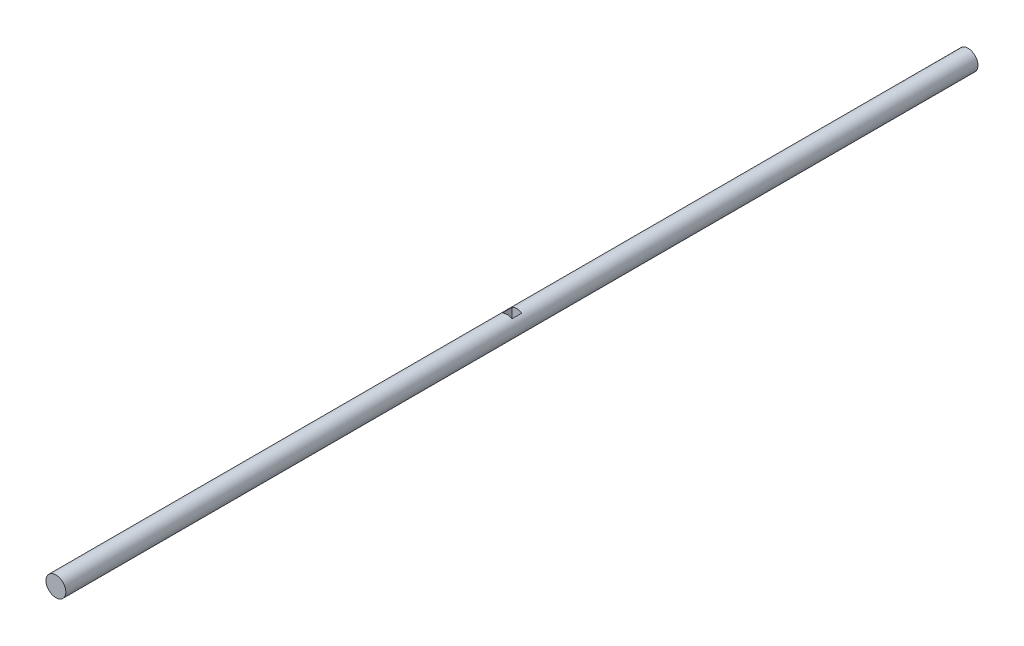
ISO-10303-21;
HEADER;
FILE_DESCRIPTION(('STEP AP214'),'2;1');
FILE_NAME('part.step','',(''),(''),'','','');
FILE_SCHEMA(('AUTOMOTIVE_DESIGN { 1 0 10303 214 1 1 1 1 }'));
ENDSEC;
DATA;
#1=APPLICATION_CONTEXT('core data for automotive mechanical design processes');
#2=APPLICATION_PROTOCOL_DEFINITION('international standard','automotive_design',2000,#1);
#3=PRODUCT_CONTEXT('',#1,'mechanical');
#4=PRODUCT('Part','Part','',(#3));
#5=PRODUCT_RELATED_PRODUCT_CATEGORY('part','',(#4));
#6=PRODUCT_DEFINITION_FORMATION('','',#4);
#7=PRODUCT_DEFINITION_CONTEXT('part definition',#1,'design');
#8=PRODUCT_DEFINITION('design','',#6,#7);
#9=PRODUCT_DEFINITION_SHAPE('','',#8);
#10=(LENGTH_UNIT() NAMED_UNIT(*) SI_UNIT(.MILLI.,.METRE.));
#11=(NAMED_UNIT(*) PLANE_ANGLE_UNIT() SI_UNIT($,.RADIAN.));
#12=(NAMED_UNIT(*) SI_UNIT($,.STERADIAN.) SOLID_ANGLE_UNIT());
#13=UNCERTAINTY_MEASURE_WITH_UNIT(LENGTH_MEASURE(1.E-05),#10,'distance_accuracy_value','');
#14=(GEOMETRIC_REPRESENTATION_CONTEXT(3) GLOBAL_UNCERTAINTY_ASSIGNED_CONTEXT((#13)) GLOBAL_UNIT_ASSIGNED_CONTEXT((#10,
#11,#12)) REPRESENTATION_CONTEXT('',''));
#15=CARTESIAN_POINT('',(0.,0.,0.));
#16=DIRECTION('',(0.,0.,1.));
#17=DIRECTION('',(1.,0.,0.));
#18=AXIS2_PLACEMENT_3D('',#15,#16,#17);
#19=CARTESIAN_POINT('',(0.,0.,230.));
#20=DIRECTION('',(0.,0.,-1.));
#21=DIRECTION('',(-1.,0.,0.));
#22=AXIS2_PLACEMENT_3D('',#19,#20,#21);
#23=CYLINDRICAL_SURFACE('',#22,2.5);
#24=CARTESIAN_POINT('',(0.,0.,116.25));
#25=DIRECTION('',(0.,0.,1.));
#26=DIRECTION('',(1.,0.,0.));
#27=AXIS2_PLACEMENT_3D('',#24,#25,#26);
#28=CIRCLE('',#27,2.5);
#29=CARTESIAN_POINT('',(1.25000000000001,2.16506350946109,116.25));
#30=VERTEX_POINT('',#29);
#31=CARTESIAN_POINT('',(-1.24999999999999,2.1650635094611,116.25));
#32=VERTEX_POINT('',#31);
#33=EDGE_CURVE('E89',#30,#32,#28,.T.);
#34=ORIENTED_EDGE('',*,*,#33,.T.);
#35=DIRECTION('',(0.,0.,-1.));
#36=VECTOR('',#35,1.);
#37=CARTESIAN_POINT('',(-1.24999999999996,2.16506350946112,230.));
#38=LINE('',#37,#36);
#39=CARTESIAN_POINT('',(-1.24999999999999,2.1650635094611,113.75));
#40=VERTEX_POINT('',#39);
#41=EDGE_CURVE('E11',#32,#40,#38,.T.);
#42=ORIENTED_EDGE('',*,*,#41,.T.);
#43=CARTESIAN_POINT('',(0.,0.,113.75));
#44=DIRECTION('',(0.,0.,-1.));
#45=DIRECTION('',(-1.,0.,0.));
#46=AXIS2_PLACEMENT_3D('',#43,#44,#45);
#47=CIRCLE('',#46,2.5);
#48=CARTESIAN_POINT('',(1.25000000000001,2.16506350946108,113.75));
#49=VERTEX_POINT('',#48);
#50=EDGE_CURVE('E50',#40,#49,#47,.T.);
#51=ORIENTED_EDGE('',*,*,#50,.T.);
#52=DIRECTION('',(0.,0.,-1.));
#53=VECTOR('',#52,1.);
#54=CARTESIAN_POINT('',(1.25000000000003,2.16506350946108,230.));
#55=LINE('',#54,#53);
#56=EDGE_CURVE('E105',#49,#30,#55,.F.);
#57=ORIENTED_EDGE('',*,*,#56,.T.);
#58=EDGE_LOOP('',(#34,#42,#51,#57));
#59=FACE_BOUND('',#58,.T.);
#60=CARTESIAN_POINT('',(1.25000000000001,-2.16506350946108,113.75));
#61=VERTEX_POINT('',#60);
#62=CARTESIAN_POINT('',(-1.24999999999999,-2.1650635094611,113.75));
#63=VERTEX_POINT('',#62);
#64=EDGE_CURVE('E100',#61,#63,#47,.T.);
#65=ORIENTED_EDGE('',*,*,#64,.T.);
#66=DIRECTION('',(0.,0.,-1.));
#67=VECTOR('',#66,1.);
#68=CARTESIAN_POINT('',(-1.24999999999996,-2.16506350946112,230.));
#69=LINE('',#68,#67);
#70=CARTESIAN_POINT('',(-1.24999999999999,-2.1650635094611,116.25));
#71=VERTEX_POINT('',#70);
#72=EDGE_CURVE('E93',#63,#71,#69,.F.);
#73=ORIENTED_EDGE('',*,*,#72,.T.);
#74=CARTESIAN_POINT('',(1.25000000000001,-2.16506350946109,116.25));
#75=VERTEX_POINT('',#74);
#76=EDGE_CURVE('E80',#71,#75,#28,.T.);
#77=ORIENTED_EDGE('',*,*,#76,.T.);
#78=DIRECTION('',(0.,0.,-1.));
#79=VECTOR('',#78,1.);
#80=CARTESIAN_POINT('',(1.25000000000003,-2.16506350946108,230.));
#81=LINE('',#80,#79);
#82=EDGE_CURVE('E86',#75,#61,#81,.T.);
#83=ORIENTED_EDGE('',*,*,#82,.T.);
#84=EDGE_LOOP('',(#65,#73,#77,#83));
#85=FACE_BOUND('',#84,.T.);
#86=CARTESIAN_POINT('',(0.,0.,230.));
#87=DIRECTION('',(0.,0.,1.));
#88=DIRECTION('',(1.,0.,0.));
#89=AXIS2_PLACEMENT_3D('',#86,#87,#88);
#90=CIRCLE('',#89,2.5);
#91=CARTESIAN_POINT('',(2.5,0.,230.));
#92=VERTEX_POINT('',#91);
#93=EDGE_CURVE('E87',#92,#92,#90,.T.);
#94=ORIENTED_EDGE('',*,*,#93,.F.);
#95=EDGE_LOOP('',(#94));
#96=FACE_BOUND('',#95,.T.);
#97=CARTESIAN_POINT('',(0.,0.,0.));
#98=DIRECTION('',(0.,0.,1.));
#99=DIRECTION('',(1.,0.,0.));
#100=AXIS2_PLACEMENT_3D('',#97,#98,#99);
#101=CIRCLE('',#100,2.5);
#102=CARTESIAN_POINT('',(2.5,0.,0.));
#103=VERTEX_POINT('',#102);
#104=EDGE_CURVE('E120',#103,#103,#101,.T.);
#105=ORIENTED_EDGE('',*,*,#104,.T.);
#106=EDGE_LOOP('',(#105));
#107=FACE_BOUND('',#106,.T.);
#108=ADVANCED_FACE('F42',(#59,#85,#96,#107),#23,.T.);
#109=CARTESIAN_POINT('',(0.,0.,230.));
#110=DIRECTION('',(0.,0.,1.));
#111=DIRECTION('',(1.,0.,0.));
#112=AXIS2_PLACEMENT_3D('',#109,#110,#111);
#113=PLANE('',#112);
#114=ORIENTED_EDGE('',*,*,#93,.T.);
#115=EDGE_LOOP('',(#114));
#116=FACE_BOUND('',#115,.T.);
#117=ADVANCED_FACE('F144',(#116),#113,.T.);
#118=CARTESIAN_POINT('',(0.,0.,0.));
#119=DIRECTION('',(0.,0.,1.));
#120=DIRECTION('',(1.,0.,0.));
#121=AXIS2_PLACEMENT_3D('',#118,#119,#120);
#122=PLANE('',#121);
#123=ORIENTED_EDGE('',*,*,#104,.F.);
#124=EDGE_LOOP('',(#123));
#125=FACE_BOUND('',#124,.T.);
#126=ADVANCED_FACE('F148',(#125),#122,.F.);
#127=CARTESIAN_POINT('',(-1.24999999999999,-5.,113.75));
#128=DIRECTION('',(-1.,0.,0.));
#129=DIRECTION('',(0.,0.,1.));
#130=AXIS2_PLACEMENT_3D('',#127,#128,#129);
#131=PLANE('',#130);
#132=DIRECTION('',(0.,1.,0.));
#133=VECTOR('',#132,1.);
#134=CARTESIAN_POINT('',(-1.24999999999999,-5.,116.25));
#135=LINE('',#134,#133);
#136=EDGE_CURVE('E57',#71,#32,#135,.T.);
#137=ORIENTED_EDGE('',*,*,#136,.F.);
#138=ORIENTED_EDGE('',*,*,#72,.F.);
#139=DIRECTION('',(0.,1.,0.));
#140=VECTOR('',#139,1.);
#141=CARTESIAN_POINT('',(-1.24999999999999,-5.,113.75));
#142=LINE('',#141,#140);
#143=EDGE_CURVE('E116',#63,#40,#142,.T.);
#144=ORIENTED_EDGE('',*,*,#143,.T.);
#145=ORIENTED_EDGE('',*,*,#41,.F.);
#146=EDGE_LOOP('',(#137,#138,#144,#145));
#147=FACE_BOUND('',#146,.T.);
#148=ADVANCED_FACE('F91',(#147),#131,.F.);
#149=CARTESIAN_POINT('',(1.25000000000001,-5.,113.75));
#150=DIRECTION('',(0.,0.,-1.));
#151=DIRECTION('',(-1.,0.,0.));
#152=AXIS2_PLACEMENT_3D('',#149,#150,#151);
#153=PLANE('',#152);
#154=ORIENTED_EDGE('',*,*,#143,.F.);
#155=ORIENTED_EDGE('',*,*,#64,.F.);
#156=DIRECTION('',(0.,1.,0.));
#157=VECTOR('',#156,1.);
#158=CARTESIAN_POINT('',(1.25000000000001,-5.,113.75));
#159=LINE('',#158,#157);
#160=EDGE_CURVE('E118',#61,#49,#159,.T.);
#161=ORIENTED_EDGE('',*,*,#160,.T.);
#162=ORIENTED_EDGE('',*,*,#50,.F.);
#163=EDGE_LOOP('',(#154,#155,#161,#162));
#164=FACE_BOUND('',#163,.T.);
#165=ADVANCED_FACE('F115',(#164),#153,.F.);
#166=CARTESIAN_POINT('',(1.25000000000001,-5.,113.75));
#167=DIRECTION('',(1.,0.,0.));
#168=DIRECTION('',(0.,0.,-1.));
#169=AXIS2_PLACEMENT_3D('',#166,#167,#168);
#170=PLANE('',#169);
#171=DIRECTION('',(0.,1.,0.));
#172=VECTOR('',#171,1.);
#173=CARTESIAN_POINT('',(1.25000000000001,-5.,116.25));
#174=LINE('',#173,#172);
#175=EDGE_CURVE('E62',#75,#30,#174,.T.);
#176=ORIENTED_EDGE('',*,*,#175,.T.);
#177=ORIENTED_EDGE('',*,*,#56,.F.);
#178=ORIENTED_EDGE('',*,*,#160,.F.);
#179=ORIENTED_EDGE('',*,*,#82,.F.);
#180=EDGE_LOOP('',(#176,#177,#178,#179));
#181=FACE_BOUND('',#180,.T.);
#182=ADVANCED_FACE('F134',(#181),#170,.F.);
#183=CARTESIAN_POINT('',(1.25000000000001,-5.,116.25));
#184=DIRECTION('',(0.,0.,1.));
#185=DIRECTION('',(1.,0.,0.));
#186=AXIS2_PLACEMENT_3D('',#183,#184,#185);
#187=PLANE('',#186);
#188=ORIENTED_EDGE('',*,*,#175,.F.);
#189=ORIENTED_EDGE('',*,*,#76,.F.);
#190=ORIENTED_EDGE('',*,*,#136,.T.);
#191=ORIENTED_EDGE('',*,*,#33,.F.);
#192=EDGE_LOOP('',(#188,#189,#190,#191));
#193=FACE_BOUND('',#192,.T.);
#194=ADVANCED_FACE('F81',(#193),#187,.F.);
#195=CLOSED_SHELL('',(#108,#117,#126,#148,#165,#182,#194));
#196=MANIFOLD_SOLID_BREP('B2',#195);
#197=ADVANCED_BREP_SHAPE_REPRESENTATION('',(#18,#196),#14);
#198=SHAPE_DEFINITION_REPRESENTATION(#9,#197);
ENDSEC;
END-ISO-10303-21;
